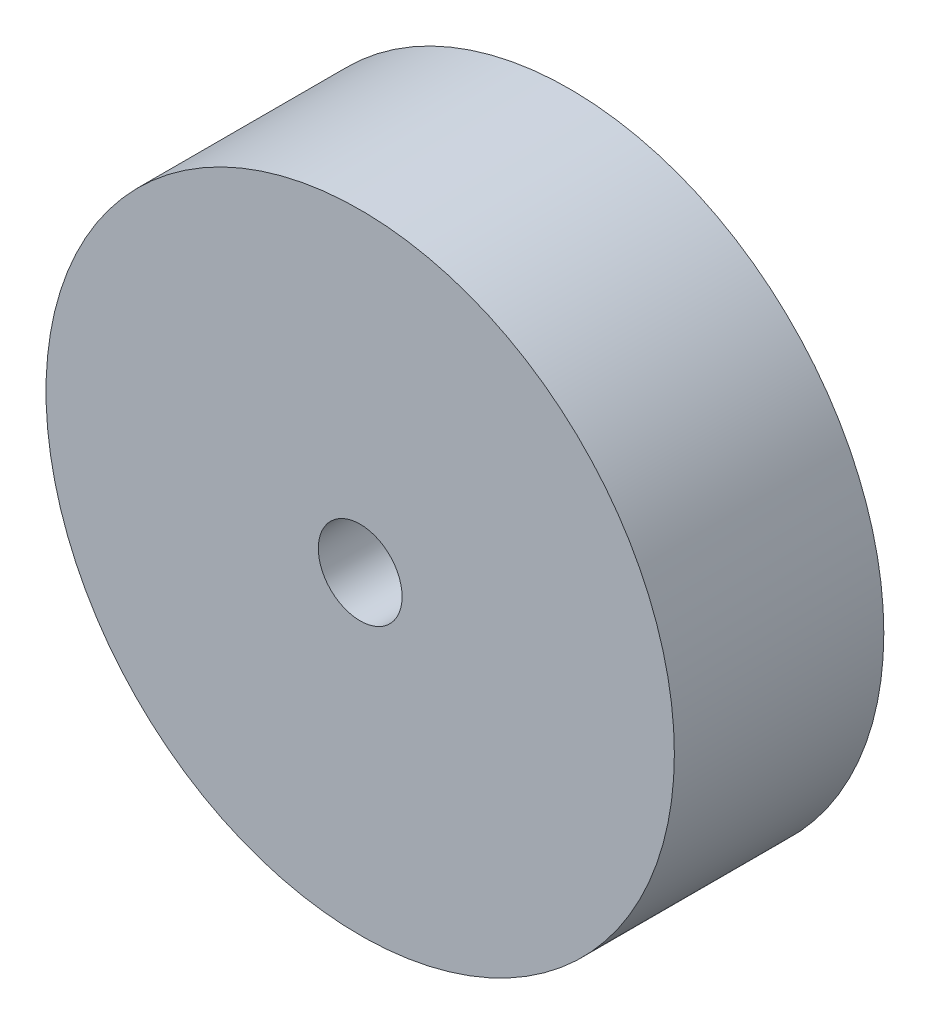
ISO-10303-21;
HEADER;
FILE_DESCRIPTION(('STEP AP214'),'2;1');
FILE_NAME('part.step','',(''),(''),'','','');
FILE_SCHEMA(('AUTOMOTIVE_DESIGN { 1 0 10303 214 1 1 1 1 }'));
ENDSEC;
DATA;
#1=APPLICATION_CONTEXT('core data for automotive mechanical design processes');
#2=APPLICATION_PROTOCOL_DEFINITION('international standard','automotive_design',2000,#1);
#3=PRODUCT_CONTEXT('',#1,'mechanical');
#4=PRODUCT('Part','Part','',(#3));
#5=PRODUCT_RELATED_PRODUCT_CATEGORY('part','',(#4));
#6=PRODUCT_DEFINITION_FORMATION('','',#4);
#7=PRODUCT_DEFINITION_CONTEXT('part definition',#1,'design');
#8=PRODUCT_DEFINITION('design','',#6,#7);
#9=PRODUCT_DEFINITION_SHAPE('','',#8);
#10=(LENGTH_UNIT() NAMED_UNIT(*) SI_UNIT(.MILLI.,.METRE.));
#11=(NAMED_UNIT(*) PLANE_ANGLE_UNIT() SI_UNIT($,.RADIAN.));
#12=(NAMED_UNIT(*) SI_UNIT($,.STERADIAN.) SOLID_ANGLE_UNIT());
#13=UNCERTAINTY_MEASURE_WITH_UNIT(LENGTH_MEASURE(1.E-05),#10,'distance_accuracy_value','');
#14=(GEOMETRIC_REPRESENTATION_CONTEXT(3) GLOBAL_UNCERTAINTY_ASSIGNED_CONTEXT((#13)) GLOBAL_UNIT_ASSIGNED_CONTEXT((#10,
#11,#12)) REPRESENTATION_CONTEXT('',''));
#15=CARTESIAN_POINT('',(0.,0.,0.));
#16=DIRECTION('',(0.,0.,1.));
#17=DIRECTION('',(1.,0.,0.));
#18=AXIS2_PLACEMENT_3D('',#15,#16,#17);
#19=CARTESIAN_POINT('',(0.,0.,10.));
#20=DIRECTION('',(0.,0.,1.));
#21=DIRECTION('',(1.,0.,0.));
#22=AXIS2_PLACEMENT_3D('',#19,#20,#21);
#23=PLANE('',#22);
#24=CARTESIAN_POINT('',(0.,0.,10.));
#25=DIRECTION('',(0.,0.,1.));
#26=DIRECTION('',(1.,0.,0.));
#27=AXIS2_PLACEMENT_3D('',#24,#25,#26);
#28=CIRCLE('',#27,15.);
#29=CARTESIAN_POINT('',(15.,0.,10.));
#30=VERTEX_POINT('',#29);
#31=EDGE_CURVE('E10',#30,#30,#28,.T.);
#32=ORIENTED_EDGE('',*,*,#31,.T.);
#33=EDGE_LOOP('',(#32));
#34=FACE_BOUND('',#33,.T.);
#35=CARTESIAN_POINT('',(0.,0.,10.));
#36=DIRECTION('',(0.,0.,1.));
#37=DIRECTION('',(1.,0.,0.));
#38=AXIS2_PLACEMENT_3D('',#35,#36,#37);
#39=CIRCLE('',#38,2.);
#40=CARTESIAN_POINT('',(2.,0.,10.));
#41=VERTEX_POINT('',#40);
#42=EDGE_CURVE('E56',#41,#41,#39,.T.);
#43=ORIENTED_EDGE('',*,*,#42,.F.);
#44=EDGE_LOOP('',(#43));
#45=FACE_BOUND('',#44,.T.);
#46=ADVANCED_FACE('F43',(#34,#45),#23,.T.);
#47=CARTESIAN_POINT('',(0.,0.,0.));
#48=DIRECTION('',(0.,0.,1.));
#49=DIRECTION('',(1.,0.,0.));
#50=AXIS2_PLACEMENT_3D('',#47,#48,#49);
#51=PLANE('',#50);
#52=CARTESIAN_POINT('',(0.,0.,0.));
#53=DIRECTION('',(0.,0.,1.));
#54=DIRECTION('',(1.,0.,0.));
#55=AXIS2_PLACEMENT_3D('',#52,#53,#54);
#56=CIRCLE('',#55,15.);
#57=CARTESIAN_POINT('',(15.,0.,0.));
#58=VERTEX_POINT('',#57);
#59=EDGE_CURVE('E47',#58,#58,#56,.T.);
#60=ORIENTED_EDGE('',*,*,#59,.F.);
#61=EDGE_LOOP('',(#60));
#62=FACE_BOUND('',#61,.T.);
#63=CARTESIAN_POINT('',(0.,0.,0.));
#64=DIRECTION('',(0.,0.,1.));
#65=DIRECTION('',(1.,0.,0.));
#66=AXIS2_PLACEMENT_3D('',#63,#64,#65);
#67=CIRCLE('',#66,2.);
#68=CARTESIAN_POINT('',(2.,0.,0.));
#69=VERTEX_POINT('',#68);
#70=EDGE_CURVE('E58',#69,#69,#67,.T.);
#71=ORIENTED_EDGE('',*,*,#70,.T.);
#72=EDGE_LOOP('',(#71));
#73=FACE_BOUND('',#72,.T.);
#74=ADVANCED_FACE('F70',(#62,#73),#51,.F.);
#75=CARTESIAN_POINT('',(0.,0.,10.));
#76=DIRECTION('',(0.,0.,-1.));
#77=DIRECTION('',(-1.,0.,0.));
#78=AXIS2_PLACEMENT_3D('',#75,#76,#77);
#79=CYLINDRICAL_SURFACE('',#78,15.);
#80=ORIENTED_EDGE('',*,*,#31,.F.);
#81=EDGE_LOOP('',(#80));
#82=FACE_BOUND('',#81,.T.);
#83=ORIENTED_EDGE('',*,*,#59,.T.);
#84=EDGE_LOOP('',(#83));
#85=FACE_BOUND('',#84,.T.);
#86=ADVANCED_FACE('F45',(#82,#85),#79,.T.);
#87=CARTESIAN_POINT('',(0.,0.,10.));
#88=DIRECTION('',(0.,0.,-1.));
#89=DIRECTION('',(-1.,0.,0.));
#90=AXIS2_PLACEMENT_3D('',#87,#88,#89);
#91=CYLINDRICAL_SURFACE('',#90,2.);
#92=ORIENTED_EDGE('',*,*,#42,.T.);
#93=EDGE_LOOP('',(#92));
#94=FACE_BOUND('',#93,.T.);
#95=ORIENTED_EDGE('',*,*,#70,.F.);
#96=EDGE_LOOP('',(#95));
#97=FACE_BOUND('',#96,.T.);
#98=ADVANCED_FACE('F66',(#94,#97),#91,.F.);
#99=CLOSED_SHELL('',(#46,#74,#86,#98));
#100=MANIFOLD_SOLID_BREP('B2',#99);
#101=ADVANCED_BREP_SHAPE_REPRESENTATION('',(#18,#100),#14);
#102=SHAPE_DEFINITION_REPRESENTATION(#9,#101);
ENDSEC;
END-ISO-10303-21;
